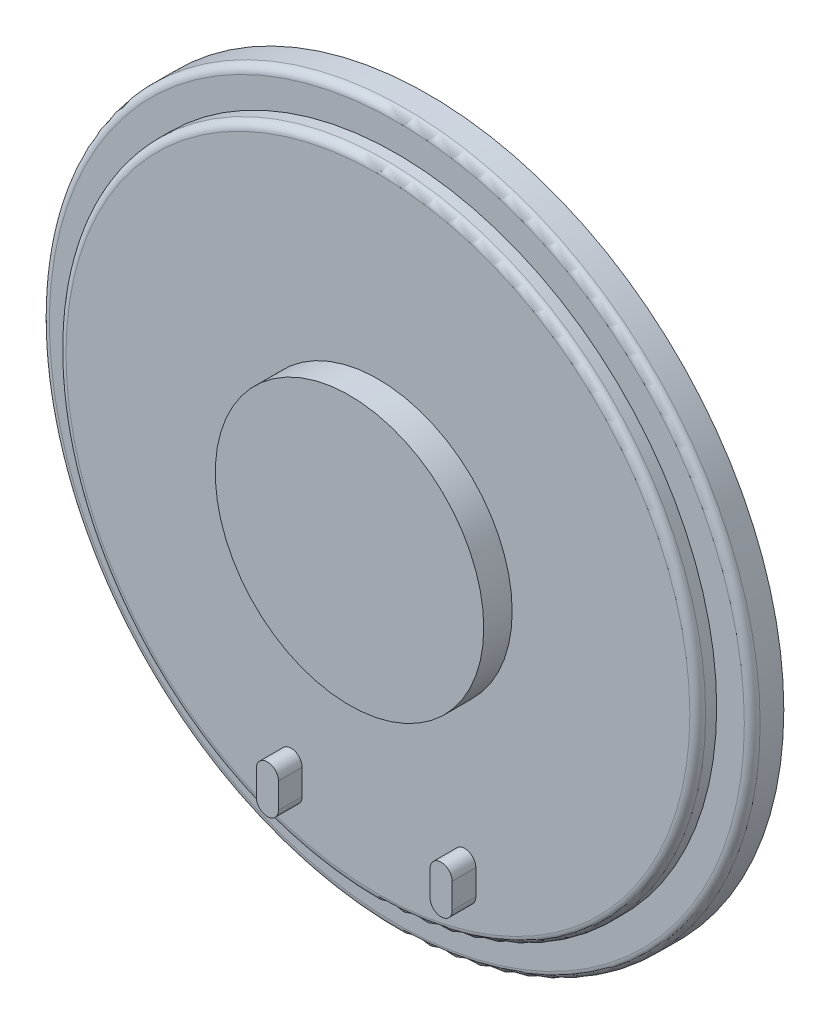
ISO-10303-21;
HEADER;
FILE_DESCRIPTION(('STEP AP214'),'2;1');
FILE_NAME('part.step','',(''),(''),'','','');
FILE_SCHEMA(('AUTOMOTIVE_DESIGN { 1 0 10303 214 1 1 1 1 }'));
ENDSEC;
DATA;
#1=APPLICATION_CONTEXT('core data for automotive mechanical design processes');
#2=APPLICATION_PROTOCOL_DEFINITION('international standard','automotive_design',2000,#1);
#3=PRODUCT_CONTEXT('',#1,'mechanical');
#4=PRODUCT('Part','Part','',(#3));
#5=PRODUCT_RELATED_PRODUCT_CATEGORY('part','',(#4));
#6=PRODUCT_DEFINITION_FORMATION('','',#4);
#7=PRODUCT_DEFINITION_CONTEXT('part definition',#1,'design');
#8=PRODUCT_DEFINITION('design','',#6,#7);
#9=PRODUCT_DEFINITION_SHAPE('','',#8);
#10=(LENGTH_UNIT() NAMED_UNIT(*) SI_UNIT(.MILLI.,.METRE.));
#11=(NAMED_UNIT(*) PLANE_ANGLE_UNIT() SI_UNIT($,.RADIAN.));
#12=(NAMED_UNIT(*) SI_UNIT($,.STERADIAN.) SOLID_ANGLE_UNIT());
#13=UNCERTAINTY_MEASURE_WITH_UNIT(LENGTH_MEASURE(1.E-05),#10,'distance_accuracy_value','');
#14=(GEOMETRIC_REPRESENTATION_CONTEXT(3) GLOBAL_UNCERTAINTY_ASSIGNED_CONTEXT((#13)) GLOBAL_UNIT_ASSIGNED_CONTEXT((#10,
#11,#12)) REPRESENTATION_CONTEXT('',''));
#15=CARTESIAN_POINT('',(0.,0.,0.));
#16=DIRECTION('',(0.,0.,1.));
#17=DIRECTION('',(1.,0.,0.));
#18=AXIS2_PLACEMENT_3D('',#15,#16,#17);
#19=CARTESIAN_POINT('',(0.,0.,3.2));
#20=DIRECTION('',(0.,0.,1.));
#21=DIRECTION('',(1.,0.,0.));
#22=AXIS2_PLACEMENT_3D('',#19,#20,#21);
#23=PLANE('',#22);
#24=DIRECTION('',(0.,-1.,0.));
#25=VECTOR('',#24,1.);
#26=CARTESIAN_POINT('',(-6.2,-15.2,3.2));
#27=LINE('',#26,#25);
#28=CARTESIAN_POINT('',(-6.2,-15.2,3.2));
#29=VERTEX_POINT('',#28);
#30=CARTESIAN_POINT('',(-6.2,-16.8,3.2));
#31=VERTEX_POINT('',#30);
#32=EDGE_CURVE('E130',#29,#31,#27,.T.);
#33=ORIENTED_EDGE('',*,*,#32,.F.);
#34=CARTESIAN_POINT('',(-5.5,-15.2,3.2));
#35=DIRECTION('',(0.,0.,1.));
#36=DIRECTION('',(1.,0.,0.));
#37=AXIS2_PLACEMENT_3D('',#34,#35,#36);
#38=CIRCLE('',#37,0.700000000000001);
#39=CARTESIAN_POINT('',(-4.8,-15.2,3.2));
#40=VERTEX_POINT('',#39);
#41=EDGE_CURVE('E127',#40,#29,#38,.T.);
#42=ORIENTED_EDGE('',*,*,#41,.F.);
#43=DIRECTION('',(0.,1.,0.));
#44=VECTOR('',#43,1.);
#45=CARTESIAN_POINT('',(-4.8,-15.2,3.2));
#46=LINE('',#45,#44);
#47=CARTESIAN_POINT('',(-4.8,-16.8,3.2));
#48=VERTEX_POINT('',#47);
#49=EDGE_CURVE('E139',#48,#40,#46,.T.);
#50=ORIENTED_EDGE('',*,*,#49,.F.);
#51=CARTESIAN_POINT('',(-5.5,-16.8,3.2));
#52=DIRECTION('',(0.,0.,1.));
#53=DIRECTION('',(1.,0.,0.));
#54=AXIS2_PLACEMENT_3D('',#51,#52,#53);
#55=CIRCLE('',#54,0.700000000000001);
#56=EDGE_CURVE('E147',#31,#48,#55,.T.);
#57=ORIENTED_EDGE('',*,*,#56,.F.);
#58=EDGE_LOOP('',(#33,#42,#50,#57));
#59=FACE_BOUND('',#58,.T.);
#60=CARTESIAN_POINT('',(0.,0.,3.2));
#61=DIRECTION('',(0.,0.,1.));
#62=DIRECTION('',(1.,0.,0.));
#63=AXIS2_PLACEMENT_3D('',#60,#61,#62);
#64=CIRCLE('',#63,19.75);
#65=CARTESIAN_POINT('',(19.75,0.,3.2));
#66=VERTEX_POINT('',#65);
#67=EDGE_CURVE('E13',#66,#66,#64,.T.);
#68=ORIENTED_EDGE('',*,*,#67,.T.);
#69=EDGE_LOOP('',(#68));
#70=FACE_BOUND('',#69,.T.);
#71=CARTESIAN_POINT('',(0.,0.,3.2));
#72=DIRECTION('',(0.,0.,1.));
#73=DIRECTION('',(1.,0.,0.));
#74=AXIS2_PLACEMENT_3D('',#71,#72,#73);
#75=CIRCLE('',#74,8.5);
#76=CARTESIAN_POINT('',(8.5,0.,3.2));
#77=VERTEX_POINT('',#76);
#78=EDGE_CURVE('E162',#77,#77,#75,.T.);
#79=ORIENTED_EDGE('',*,*,#78,.F.);
#80=EDGE_LOOP('',(#79));
#81=FACE_BOUND('',#80,.T.);
#82=DIRECTION('',(0.,-1.,0.));
#83=VECTOR('',#82,1.);
#84=CARTESIAN_POINT('',(4.8,-15.2,3.2));
#85=LINE('',#84,#83);
#86=CARTESIAN_POINT('',(4.8,-15.2,3.2));
#87=VERTEX_POINT('',#86);
#88=CARTESIAN_POINT('',(4.8,-16.8,3.2));
#89=VERTEX_POINT('',#88);
#90=EDGE_CURVE('E392',#87,#89,#85,.T.);
#91=ORIENTED_EDGE('',*,*,#90,.F.);
#92=CARTESIAN_POINT('',(5.5,-15.2,3.2));
#93=DIRECTION('',(0.,0.,1.));
#94=DIRECTION('',(-1.,0.,0.));
#95=AXIS2_PLACEMENT_3D('',#92,#93,#94);
#96=CIRCLE('',#95,0.700000000000001);
#97=CARTESIAN_POINT('',(6.2,-15.2,3.2));
#98=VERTEX_POINT('',#97);
#99=EDGE_CURVE('E125',#98,#87,#96,.T.);
#100=ORIENTED_EDGE('',*,*,#99,.F.);
#101=DIRECTION('',(0.,1.,0.));
#102=VECTOR('',#101,1.);
#103=CARTESIAN_POINT('',(6.2,-15.2,3.2));
#104=LINE('',#103,#102);
#105=CARTESIAN_POINT('',(6.2,-16.8,3.2));
#106=VERTEX_POINT('',#105);
#107=EDGE_CURVE('E121',#106,#98,#104,.T.);
#108=ORIENTED_EDGE('',*,*,#107,.F.);
#109=CARTESIAN_POINT('',(5.5,-16.8,3.2));
#110=DIRECTION('',(0.,0.,1.));
#111=DIRECTION('',(-1.,0.,0.));
#112=AXIS2_PLACEMENT_3D('',#109,#110,#111);
#113=CIRCLE('',#112,0.700000000000001);
#114=EDGE_CURVE('E394',#89,#106,#113,.T.);
#115=ORIENTED_EDGE('',*,*,#114,.F.);
#116=EDGE_LOOP('',(#91,#100,#108,#115));
#117=FACE_BOUND('',#116,.T.);
#118=ADVANCED_FACE('F36',(#59,#70,#81,#117),#23,.T.);
#119=CARTESIAN_POINT('',(0.,0.,-64.2760064098572));
#120=DIRECTION('',(0.,0.,1.));
#121=DIRECTION('',(1.,0.,0.));
#122=AXIS2_PLACEMENT_3D('',#119,#120,#121);
#123=CYLINDRICAL_SURFACE('',#122,20.25);
#124=CARTESIAN_POINT('',(0.,0.,2.69999999999999));
#125=DIRECTION('',(0.,0.,1.));
#126=DIRECTION('',(1.,0.,0.));
#127=AXIS2_PLACEMENT_3D('',#124,#125,#126);
#128=CIRCLE('',#127,20.25);
#129=CARTESIAN_POINT('',(20.25,0.,2.69999999999999));
#130=VERTEX_POINT('',#129);
#131=EDGE_CURVE('E44',#130,#130,#128,.F.);
#132=ORIENTED_EDGE('',*,*,#131,.T.);
#133=EDGE_LOOP('',(#132));
#134=FACE_BOUND('',#133,.T.);
#135=CARTESIAN_POINT('',(0.,0.,2.));
#136=DIRECTION('',(0.,0.,1.));
#137=DIRECTION('',(1.,0.,0.));
#138=AXIS2_PLACEMENT_3D('',#135,#136,#137);
#139=CIRCLE('',#138,20.25);
#140=CARTESIAN_POINT('',(20.25,0.,2.));
#141=VERTEX_POINT('',#140);
#142=EDGE_CURVE('E165',#141,#141,#139,.F.);
#143=ORIENTED_EDGE('',*,*,#142,.F.);
#144=EDGE_LOOP('',(#143));
#145=FACE_BOUND('',#144,.T.);
#146=ADVANCED_FACE('F187',(#134,#145),#123,.T.);
#147=CARTESIAN_POINT('',(0.,0.,5.));
#148=DIRECTION('',(0.,0.,-1.));
#149=DIRECTION('',(-1.,0.,0.));
#150=AXIS2_PLACEMENT_3D('',#147,#148,#149);
#151=CYLINDRICAL_SURFACE('',#150,22.5);
#152=CARTESIAN_POINT('',(0.,0.,1.5));
#153=DIRECTION('',(0.,0.,1.));
#154=DIRECTION('',(1.,0.,0.));
#155=AXIS2_PLACEMENT_3D('',#152,#153,#154);
#156=CIRCLE('',#155,22.5);
#157=CARTESIAN_POINT('',(22.5,0.,1.5));
#158=VERTEX_POINT('',#157);
#159=EDGE_CURVE('E182',#158,#158,#156,.F.);
#160=ORIENTED_EDGE('',*,*,#159,.T.);
#161=EDGE_LOOP('',(#160));
#162=FACE_BOUND('',#161,.T.);
#163=CARTESIAN_POINT('',(0.,0.,0.));
#164=DIRECTION('',(0.,0.,1.));
#165=DIRECTION('',(1.,0.,0.));
#166=AXIS2_PLACEMENT_3D('',#163,#164,#165);
#167=CIRCLE('',#166,22.5);
#168=CARTESIAN_POINT('',(22.5,0.,0.));
#169=VERTEX_POINT('',#168);
#170=EDGE_CURVE('E170',#169,#169,#167,.T.);
#171=ORIENTED_EDGE('',*,*,#170,.T.);
#172=EDGE_LOOP('',(#171));
#173=FACE_BOUND('',#172,.T.);
#174=ADVANCED_FACE('F210',(#162,#173),#151,.T.);
#175=CARTESIAN_POINT('',(0.,0.,0.));
#176=DIRECTION('',(0.,0.,1.));
#177=DIRECTION('',(1.,0.,0.));
#178=AXIS2_PLACEMENT_3D('',#175,#176,#177);
#179=PLANE('',#178);
#180=CARTESIAN_POINT('',(0.,0.,0.));
#181=DIRECTION('',(0.,0.,1.));
#182=DIRECTION('',(1.,0.,0.));
#183=AXIS2_PLACEMENT_3D('',#180,#181,#182);
#184=CIRCLE('',#183,21.75);
#185=CARTESIAN_POINT('',(21.75,0.,0.));
#186=VERTEX_POINT('',#185);
#187=EDGE_CURVE('E176',#186,#186,#184,.T.);
#188=ORIENTED_EDGE('',*,*,#187,.T.);
#189=EDGE_LOOP('',(#188));
#190=FACE_BOUND('',#189,.T.);
#191=ORIENTED_EDGE('',*,*,#170,.F.);
#192=EDGE_LOOP('',(#191));
#193=FACE_BOUND('',#192,.T.);
#194=ADVANCED_FACE('F220',(#190,#193),#179,.F.);
#195=CARTESIAN_POINT('',(0.,0.,2.));
#196=DIRECTION('',(0.,0.,1.));
#197=DIRECTION('',(1.,0.,0.));
#198=AXIS2_PLACEMENT_3D('',#195,#196,#197);
#199=PLANE('',#198);
#200=CARTESIAN_POINT('',(0.,0.,2.));
#201=DIRECTION('',(0.,0.,1.));
#202=DIRECTION('',(1.,0.,0.));
#203=AXIS2_PLACEMENT_3D('',#200,#201,#202);
#204=CIRCLE('',#203,22.);
#205=CARTESIAN_POINT('',(22.,0.,2.));
#206=VERTEX_POINT('',#205);
#207=EDGE_CURVE('E179',#206,#206,#204,.T.);
#208=ORIENTED_EDGE('',*,*,#207,.T.);
#209=EDGE_LOOP('',(#208));
#210=FACE_BOUND('',#209,.T.);
#211=ORIENTED_EDGE('',*,*,#142,.T.);
#212=EDGE_LOOP('',(#211));
#213=FACE_BOUND('',#212,.T.);
#214=ADVANCED_FACE('F218',(#210,#213),#199,.T.);
#215=CARTESIAN_POINT('',(0.,0.,3.2));
#216=DIRECTION('',(0.,0.,1.));
#217=DIRECTION('',(1.,0.,0.));
#218=AXIS2_PLACEMENT_3D('',#215,#216,#217);
#219=CYLINDRICAL_SURFACE('',#218,8.5);
#220=ORIENTED_EDGE('',*,*,#78,.T.);
#221=EDGE_LOOP('',(#220));
#222=FACE_BOUND('',#221,.T.);
#223=CARTESIAN_POINT('',(0.,0.,5.));
#224=DIRECTION('',(0.,0.,1.));
#225=DIRECTION('',(1.,0.,0.));
#226=AXIS2_PLACEMENT_3D('',#223,#224,#225);
#227=CIRCLE('',#226,8.5);
#228=CARTESIAN_POINT('',(8.5,0.,5.));
#229=VERTEX_POINT('',#228);
#230=EDGE_CURVE('E161',#229,#229,#227,.T.);
#231=ORIENTED_EDGE('',*,*,#230,.F.);
#232=EDGE_LOOP('',(#231));
#233=FACE_BOUND('',#232,.T.);
#234=ADVANCED_FACE('F216',(#222,#233),#219,.T.);
#235=CARTESIAN_POINT('',(0.,0.,5.));
#236=DIRECTION('',(0.,0.,1.));
#237=DIRECTION('',(1.,0.,0.));
#238=AXIS2_PLACEMENT_3D('',#235,#236,#237);
#239=PLANE('',#238);
#240=ORIENTED_EDGE('',*,*,#230,.T.);
#241=EDGE_LOOP('',(#240));
#242=FACE_BOUND('',#241,.T.);
#243=ADVANCED_FACE('F223',(#242),#239,.T.);
#244=CARTESIAN_POINT('',(0.,0.,1.8));
#245=DIRECTION('',(0.,0.,-1.));
#246=DIRECTION('',(-1.,0.,0.));
#247=AXIS2_PLACEMENT_3D('',#244,#245,#246);
#248=CYLINDRICAL_SURFACE('',#247,20.25);
#249=CARTESIAN_POINT('',(0.,0.,1.5));
#250=DIRECTION('',(0.,0.,1.));
#251=DIRECTION('',(1.,0.,0.));
#252=AXIS2_PLACEMENT_3D('',#249,#250,#251);
#253=CIRCLE('',#252,20.25);
#254=CARTESIAN_POINT('',(20.25,0.,1.5));
#255=VERTEX_POINT('',#254);
#256=EDGE_CURVE('E173',#255,#255,#253,.F.);
#257=ORIENTED_EDGE('',*,*,#256,.T.);
#258=EDGE_LOOP('',(#257));
#259=FACE_BOUND('',#258,.T.);
#260=CARTESIAN_POINT('',(0.,0.,1.8));
#261=DIRECTION('',(0.,0.,-1.));
#262=DIRECTION('',(-1.,0.,0.));
#263=AXIS2_PLACEMENT_3D('',#260,#261,#262);
#264=CIRCLE('',#263,20.25);
#265=CARTESIAN_POINT('',(-20.25,0.,1.8));
#266=VERTEX_POINT('',#265);
#267=EDGE_CURVE('E158',#266,#266,#264,.T.);
#268=ORIENTED_EDGE('',*,*,#267,.F.);
#269=EDGE_LOOP('',(#268));
#270=FACE_BOUND('',#269,.T.);
#271=ADVANCED_FACE('F226',(#259,#270),#248,.F.);
#272=CARTESIAN_POINT('',(0.,0.,1.8));
#273=DIRECTION('',(0.,0.,-1.));
#274=DIRECTION('',(-1.,0.,0.));
#275=AXIS2_PLACEMENT_3D('',#272,#273,#274);
#276=PLANE('',#275);
#277=ORIENTED_EDGE('',*,*,#267,.T.);
#278=EDGE_LOOP('',(#277));
#279=FACE_BOUND('',#278,.T.);
#280=ADVANCED_FACE('F235',(#279),#276,.T.);
#281=CARTESIAN_POINT('',(0.,0.,1.5));
#282=DIRECTION('',(0.,0.,1.));
#283=DIRECTION('',(1.,0.,0.));
#284=AXIS2_PLACEMENT_3D('',#281,#282,#283);
#285=TOROIDAL_SURFACE('',#284,21.75,1.5);
#286=ORIENTED_EDGE('',*,*,#187,.F.);
#287=EDGE_LOOP('',(#286));
#288=FACE_BOUND('',#287,.T.);
#289=ORIENTED_EDGE('',*,*,#256,.F.);
#290=EDGE_LOOP('',(#289));
#291=FACE_BOUND('',#290,.T.);
#292=ADVANCED_FACE('F201',(#288,#291),#285,.T.);
#293=CARTESIAN_POINT('',(0.,0.,1.5));
#294=DIRECTION('',(0.,0.,1.));
#295=DIRECTION('',(1.,0.,0.));
#296=AXIS2_PLACEMENT_3D('',#293,#294,#295);
#297=TOROIDAL_SURFACE('',#296,22.,0.5);
#298=ORIENTED_EDGE('',*,*,#159,.F.);
#299=EDGE_LOOP('',(#298));
#300=FACE_BOUND('',#299,.T.);
#301=ORIENTED_EDGE('',*,*,#207,.F.);
#302=EDGE_LOOP('',(#301));
#303=FACE_BOUND('',#302,.T.);
#304=ADVANCED_FACE('F192',(#300,#303),#297,.T.);
#305=CARTESIAN_POINT('',(0.,0.,2.69999999999999));
#306=DIRECTION('',(0.,0.,1.));
#307=DIRECTION('',(1.,0.,0.));
#308=AXIS2_PLACEMENT_3D('',#305,#306,#307);
#309=TOROIDAL_SURFACE('',#308,19.75,0.5);
#310=ORIENTED_EDGE('',*,*,#67,.F.);
#311=EDGE_LOOP('',(#310));
#312=FACE_BOUND('',#311,.T.);
#313=ORIENTED_EDGE('',*,*,#131,.F.);
#314=EDGE_LOOP('',(#313));
#315=FACE_BOUND('',#314,.T.);
#316=ADVANCED_FACE('F38',(#312,#315),#309,.T.);
#317=CARTESIAN_POINT('',(-5.5,-15.2,4.7));
#318=DIRECTION('',(0.,0.,-1.));
#319=DIRECTION('',(-1.,0.,0.));
#320=AXIS2_PLACEMENT_3D('',#317,#318,#319);
#321=CYLINDRICAL_SURFACE('',#320,0.700000000000001);
#322=ORIENTED_EDGE('',*,*,#41,.T.);
#323=DIRECTION('',(0.,0.,-1.));
#324=VECTOR('',#323,1.);
#325=CARTESIAN_POINT('',(-6.2,-15.2,4.7));
#326=LINE('',#325,#324);
#327=CARTESIAN_POINT('',(-6.2,-15.2,4.7));
#328=VERTEX_POINT('',#327);
#329=EDGE_CURVE('E156',#328,#29,#326,.T.);
#330=ORIENTED_EDGE('',*,*,#329,.F.);
#331=CARTESIAN_POINT('',(-5.5,-15.2,4.7));
#332=DIRECTION('',(0.,0.,1.));
#333=DIRECTION('',(1.,0.,0.));
#334=AXIS2_PLACEMENT_3D('',#331,#332,#333);
#335=CIRCLE('',#334,0.700000000000001);
#336=CARTESIAN_POINT('',(-4.8,-15.2,4.7));
#337=VERTEX_POINT('',#336);
#338=EDGE_CURVE('E135',#337,#328,#335,.T.);
#339=ORIENTED_EDGE('',*,*,#338,.F.);
#340=DIRECTION('',(0.,0.,-1.));
#341=VECTOR('',#340,1.);
#342=CARTESIAN_POINT('',(-4.8,-15.2,4.7));
#343=LINE('',#342,#341);
#344=EDGE_CURVE('E144',#337,#40,#343,.T.);
#345=ORIENTED_EDGE('',*,*,#344,.T.);
#346=EDGE_LOOP('',(#322,#330,#339,#345));
#347=FACE_BOUND('',#346,.T.);
#348=ADVANCED_FACE('F191',(#347),#321,.T.);
#349=CARTESIAN_POINT('',(-6.2,-15.2,4.7));
#350=DIRECTION('',(1.,0.,0.));
#351=DIRECTION('',(0.,0.,-1.));
#352=AXIS2_PLACEMENT_3D('',#349,#350,#351);
#353=PLANE('',#352);
#354=ORIENTED_EDGE('',*,*,#32,.T.);
#355=DIRECTION('',(0.,0.,-1.));
#356=VECTOR('',#355,1.);
#357=CARTESIAN_POINT('',(-6.2,-16.8,4.7));
#358=LINE('',#357,#356);
#359=CARTESIAN_POINT('',(-6.2,-16.8,4.7));
#360=VERTEX_POINT('',#359);
#361=EDGE_CURVE('E153',#360,#31,#358,.T.);
#362=ORIENTED_EDGE('',*,*,#361,.F.);
#363=DIRECTION('',(0.,-1.,0.));
#364=VECTOR('',#363,1.);
#365=CARTESIAN_POINT('',(-6.2,-15.2,4.7));
#366=LINE('',#365,#364);
#367=EDGE_CURVE('E138',#328,#360,#366,.T.);
#368=ORIENTED_EDGE('',*,*,#367,.F.);
#369=ORIENTED_EDGE('',*,*,#329,.T.);
#370=EDGE_LOOP('',(#354,#362,#368,#369));
#371=FACE_BOUND('',#370,.T.);
#372=ADVANCED_FACE('F198',(#371),#353,.F.);
#373=CARTESIAN_POINT('',(-5.5,-16.8,4.7));
#374=DIRECTION('',(0.,0.,-1.));
#375=DIRECTION('',(-1.,0.,0.));
#376=AXIS2_PLACEMENT_3D('',#373,#374,#375);
#377=CYLINDRICAL_SURFACE('',#376,0.700000000000001);
#378=ORIENTED_EDGE('',*,*,#56,.T.);
#379=DIRECTION('',(0.,0.,-1.));
#380=VECTOR('',#379,1.);
#381=CARTESIAN_POINT('',(-4.8,-16.8,4.7));
#382=LINE('',#381,#380);
#383=CARTESIAN_POINT('',(-4.8,-16.8,4.7));
#384=VERTEX_POINT('',#383);
#385=EDGE_CURVE('E59',#384,#48,#382,.T.);
#386=ORIENTED_EDGE('',*,*,#385,.F.);
#387=CARTESIAN_POINT('',(-5.5,-16.8,4.7));
#388=DIRECTION('',(0.,0.,1.));
#389=DIRECTION('',(1.,0.,0.));
#390=AXIS2_PLACEMENT_3D('',#387,#388,#389);
#391=CIRCLE('',#390,0.700000000000001);
#392=EDGE_CURVE('E141',#360,#384,#391,.T.);
#393=ORIENTED_EDGE('',*,*,#392,.F.);
#394=ORIENTED_EDGE('',*,*,#361,.T.);
#395=EDGE_LOOP('',(#378,#386,#393,#394));
#396=FACE_BOUND('',#395,.T.);
#397=ADVANCED_FACE('F254',(#396),#377,.T.);
#398=CARTESIAN_POINT('',(-4.8,-15.2,4.7));
#399=DIRECTION('',(-1.,0.,0.));
#400=DIRECTION('',(0.,0.,1.));
#401=AXIS2_PLACEMENT_3D('',#398,#399,#400);
#402=PLANE('',#401);
#403=ORIENTED_EDGE('',*,*,#49,.T.);
#404=ORIENTED_EDGE('',*,*,#344,.F.);
#405=DIRECTION('',(0.,1.,0.));
#406=VECTOR('',#405,1.);
#407=CARTESIAN_POINT('',(-4.8,-15.2,4.7));
#408=LINE('',#407,#406);
#409=EDGE_CURVE('E143',#384,#337,#408,.T.);
#410=ORIENTED_EDGE('',*,*,#409,.F.);
#411=ORIENTED_EDGE('',*,*,#385,.T.);
#412=EDGE_LOOP('',(#403,#404,#410,#411));
#413=FACE_BOUND('',#412,.T.);
#414=ADVANCED_FACE('F258',(#413),#402,.F.);
#415=CARTESIAN_POINT('',(-5.5,-15.2,4.7));
#416=DIRECTION('',(0.,0.,1.));
#417=DIRECTION('',(1.,0.,0.));
#418=AXIS2_PLACEMENT_3D('',#415,#416,#417);
#419=PLANE('',#418);
#420=ORIENTED_EDGE('',*,*,#338,.T.);
#421=ORIENTED_EDGE('',*,*,#367,.T.);
#422=ORIENTED_EDGE('',*,*,#392,.T.);
#423=ORIENTED_EDGE('',*,*,#409,.T.);
#424=EDGE_LOOP('',(#420,#421,#422,#423));
#425=FACE_BOUND('',#424,.T.);
#426=ADVANCED_FACE('F262',(#425),#419,.T.);
#427=CARTESIAN_POINT('',(5.5,-15.2,4.7));
#428=DIRECTION('',(0.,0.,-1.));
#429=DIRECTION('',(-1.,0.,0.));
#430=AXIS2_PLACEMENT_3D('',#427,#428,#429);
#431=CYLINDRICAL_SURFACE('',#430,0.700000000000001);
#432=ORIENTED_EDGE('',*,*,#99,.T.);
#433=DIRECTION('',(0.,0.,-1.));
#434=VECTOR('',#433,1.);
#435=CARTESIAN_POINT('',(4.8,-15.2,4.7));
#436=LINE('',#435,#434);
#437=CARTESIAN_POINT('',(4.8,-15.2,4.7));
#438=VERTEX_POINT('',#437);
#439=EDGE_CURVE('E106',#438,#87,#436,.T.);
#440=ORIENTED_EDGE('',*,*,#439,.F.);
#441=CARTESIAN_POINT('',(5.5,-15.2,4.7));
#442=DIRECTION('',(0.,0.,1.));
#443=DIRECTION('',(-1.,0.,0.));
#444=AXIS2_PLACEMENT_3D('',#441,#442,#443);
#445=CIRCLE('',#444,0.700000000000001);
#446=CARTESIAN_POINT('',(6.2,-15.2,4.7));
#447=VERTEX_POINT('',#446);
#448=EDGE_CURVE('E113',#447,#438,#445,.T.);
#449=ORIENTED_EDGE('',*,*,#448,.F.);
#450=DIRECTION('',(0.,0.,-1.));
#451=VECTOR('',#450,1.);
#452=CARTESIAN_POINT('',(6.2,-15.2,4.7));
#453=LINE('',#452,#451);
#454=EDGE_CURVE('E401',#447,#98,#453,.T.);
#455=ORIENTED_EDGE('',*,*,#454,.T.);
#456=EDGE_LOOP('',(#432,#440,#449,#455));
#457=FACE_BOUND('',#456,.T.);
#458=ADVANCED_FACE('F123',(#457),#431,.T.);
#459=CARTESIAN_POINT('',(4.8,-15.2,4.7));
#460=DIRECTION('',(1.,0.,0.));
#461=DIRECTION('',(0.,0.,-1.));
#462=AXIS2_PLACEMENT_3D('',#459,#460,#461);
#463=PLANE('',#462);
#464=ORIENTED_EDGE('',*,*,#90,.T.);
#465=DIRECTION('',(0.,0.,-1.));
#466=VECTOR('',#465,1.);
#467=CARTESIAN_POINT('',(4.8,-16.8,4.7));
#468=LINE('',#467,#466);
#469=CARTESIAN_POINT('',(4.8,-16.8,4.7));
#470=VERTEX_POINT('',#469);
#471=EDGE_CURVE('E109',#470,#89,#468,.T.);
#472=ORIENTED_EDGE('',*,*,#471,.F.);
#473=DIRECTION('',(0.,-1.,0.));
#474=VECTOR('',#473,1.);
#475=CARTESIAN_POINT('',(4.8,-15.2,4.7));
#476=LINE('',#475,#474);
#477=EDGE_CURVE('E102',#438,#470,#476,.T.);
#478=ORIENTED_EDGE('',*,*,#477,.F.);
#479=ORIENTED_EDGE('',*,*,#439,.T.);
#480=EDGE_LOOP('',(#464,#472,#478,#479));
#481=FACE_BOUND('',#480,.T.);
#482=ADVANCED_FACE('F104',(#481),#463,.F.);
#483=CARTESIAN_POINT('',(5.5,-16.8,4.7));
#484=DIRECTION('',(0.,0.,-1.));
#485=DIRECTION('',(-1.,0.,0.));
#486=AXIS2_PLACEMENT_3D('',#483,#484,#485);
#487=CYLINDRICAL_SURFACE('',#486,0.700000000000001);
#488=ORIENTED_EDGE('',*,*,#114,.T.);
#489=DIRECTION('',(0.,0.,-1.));
#490=VECTOR('',#489,1.);
#491=CARTESIAN_POINT('',(6.2,-16.8,4.7));
#492=LINE('',#491,#490);
#493=CARTESIAN_POINT('',(6.2,-16.8,4.7));
#494=VERTEX_POINT('',#493);
#495=EDGE_CURVE('E51',#494,#106,#492,.T.);
#496=ORIENTED_EDGE('',*,*,#495,.F.);
#497=CARTESIAN_POINT('',(5.5,-16.8,4.7));
#498=DIRECTION('',(0.,0.,1.));
#499=DIRECTION('',(-1.,0.,0.));
#500=AXIS2_PLACEMENT_3D('',#497,#498,#499);
#501=CIRCLE('',#500,0.700000000000001);
#502=EDGE_CURVE('E112',#470,#494,#501,.T.);
#503=ORIENTED_EDGE('',*,*,#502,.F.);
#504=ORIENTED_EDGE('',*,*,#471,.T.);
#505=EDGE_LOOP('',(#488,#496,#503,#504));
#506=FACE_BOUND('',#505,.T.);
#507=ADVANCED_FACE('F270',(#506),#487,.T.);
#508=CARTESIAN_POINT('',(6.2,-15.2,4.7));
#509=DIRECTION('',(-1.,0.,0.));
#510=DIRECTION('',(0.,0.,1.));
#511=AXIS2_PLACEMENT_3D('',#508,#509,#510);
#512=PLANE('',#511);
#513=ORIENTED_EDGE('',*,*,#107,.T.);
#514=ORIENTED_EDGE('',*,*,#454,.F.);
#515=DIRECTION('',(0.,1.,0.));
#516=VECTOR('',#515,1.);
#517=CARTESIAN_POINT('',(6.2,-15.2,4.7));
#518=LINE('',#517,#516);
#519=EDGE_CURVE('E117',#494,#447,#518,.T.);
#520=ORIENTED_EDGE('',*,*,#519,.F.);
#521=ORIENTED_EDGE('',*,*,#495,.T.);
#522=EDGE_LOOP('',(#513,#514,#520,#521));
#523=FACE_BOUND('',#522,.T.);
#524=ADVANCED_FACE('F273',(#523),#512,.F.);
#525=CARTESIAN_POINT('',(5.5,-15.2,4.7));
#526=DIRECTION('',(0.,0.,-1.));
#527=DIRECTION('',(-1.,0.,0.));
#528=AXIS2_PLACEMENT_3D('',#525,#526,#527);
#529=PLANE('',#528);
#530=ORIENTED_EDGE('',*,*,#448,.T.);
#531=ORIENTED_EDGE('',*,*,#477,.T.);
#532=ORIENTED_EDGE('',*,*,#502,.T.);
#533=ORIENTED_EDGE('',*,*,#519,.T.);
#534=EDGE_LOOP('',(#530,#531,#532,#533));
#535=FACE_BOUND('',#534,.T.);
#536=ADVANCED_FACE('F116',(#535),#529,.F.);
#537=CLOSED_SHELL('',(#118,#146,#174,#194,#214,#234,#243,#271,#280,#292,#304,#316,#348,#372,
#397,#414,#426,#458,#482,#507,#524,#536));
#538=MANIFOLD_SOLID_BREP('B2',#537);
#539=ADVANCED_BREP_SHAPE_REPRESENTATION('',(#18,#538),#14);
#540=SHAPE_DEFINITION_REPRESENTATION(#9,#539);
ENDSEC;
END-ISO-10303-21;
